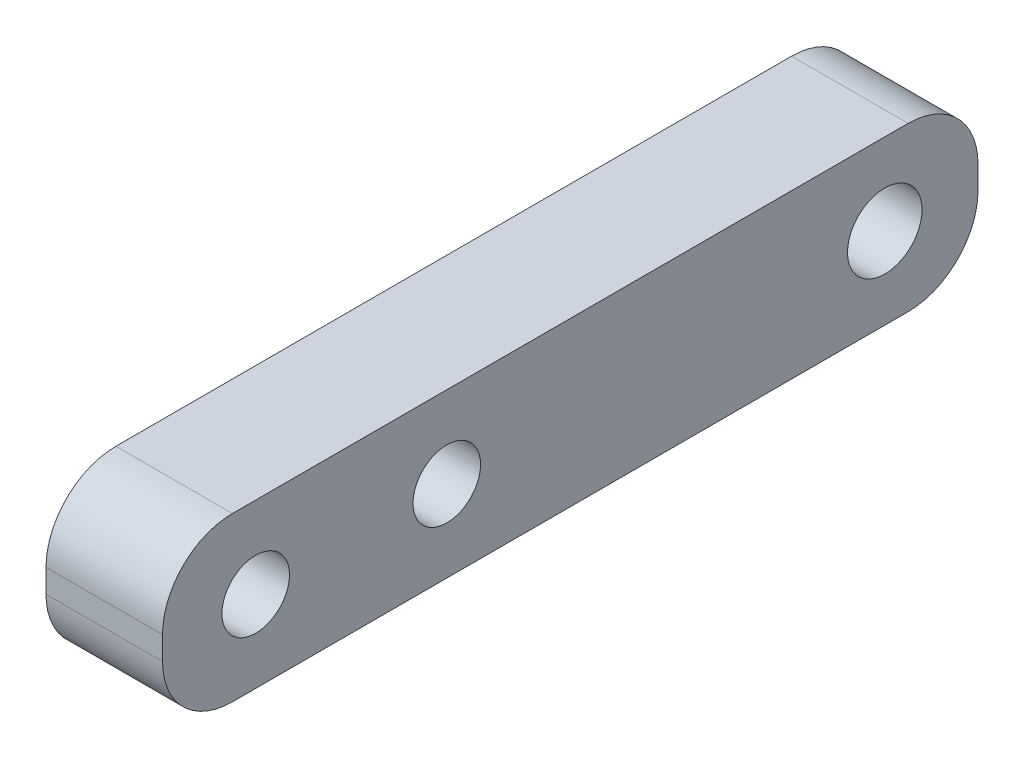
ISO-10303-21;
HEADER;
FILE_DESCRIPTION(('STEP AP214'),'2;1');
FILE_NAME('part.step','',(''),(''),'','','');
FILE_SCHEMA(('AUTOMOTIVE_DESIGN { 1 0 10303 214 1 1 1 1 }'));
ENDSEC;
DATA;
#1=APPLICATION_CONTEXT('core data for automotive mechanical design processes');
#2=APPLICATION_PROTOCOL_DEFINITION('international standard','automotive_design',2000,#1);
#3=PRODUCT_CONTEXT('',#1,'mechanical');
#4=PRODUCT('Part','Part','',(#3));
#5=PRODUCT_RELATED_PRODUCT_CATEGORY('part','',(#4));
#6=PRODUCT_DEFINITION_FORMATION('','',#4);
#7=PRODUCT_DEFINITION_CONTEXT('part definition',#1,'design');
#8=PRODUCT_DEFINITION('design','',#6,#7);
#9=PRODUCT_DEFINITION_SHAPE('','',#8);
#10=(LENGTH_UNIT() NAMED_UNIT(*) SI_UNIT(.MILLI.,.METRE.));
#11=(NAMED_UNIT(*) PLANE_ANGLE_UNIT() SI_UNIT($,.RADIAN.));
#12=(NAMED_UNIT(*) SI_UNIT($,.STERADIAN.) SOLID_ANGLE_UNIT());
#13=UNCERTAINTY_MEASURE_WITH_UNIT(LENGTH_MEASURE(1.E-05),#10,'distance_accuracy_value','');
#14=(GEOMETRIC_REPRESENTATION_CONTEXT(3) GLOBAL_UNCERTAINTY_ASSIGNED_CONTEXT((#13)) GLOBAL_UNIT_ASSIGNED_CONTEXT((#10,
#11,#12)) REPRESENTATION_CONTEXT('',''));
#15=CARTESIAN_POINT('',(0.,0.,0.));
#16=DIRECTION('',(0.,0.,1.));
#17=DIRECTION('',(1.,0.,0.));
#18=AXIS2_PLACEMENT_3D('',#15,#16,#17);
#19=CARTESIAN_POINT('',(5.,0.,0.));
#20=DIRECTION('',(0.,0.,-1.));
#21=DIRECTION('',(0.,1.,0.));
#22=AXIS2_PLACEMENT_3D('',#19,#20,#21);
#23=PLANE('',#22);
#24=DIRECTION('',(0.,-1.,0.));
#25=VECTOR('',#24,1.);
#26=CARTESIAN_POINT('',(5.,0.,0.));
#27=LINE('',#26,#25);
#28=CARTESIAN_POINT('',(5.,-3.,0.));
#29=VERTEX_POINT('',#28);
#30=CARTESIAN_POINT('',(5.,-4.,0.));
#31=VERTEX_POINT('',#30);
#32=EDGE_CURVE('E128',#29,#31,#27,.T.);
#33=ORIENTED_EDGE('',*,*,#32,.F.);
#34=DIRECTION('',(-1.,0.,0.));
#35=VECTOR('',#34,1.);
#36=CARTESIAN_POINT('',(5.,-3.,0.));
#37=LINE('',#36,#35);
#38=CARTESIAN_POINT('',(0.,-3.,0.));
#39=VERTEX_POINT('',#38);
#40=EDGE_CURVE('E11',#29,#39,#37,.T.);
#41=ORIENTED_EDGE('',*,*,#40,.T.);
#42=DIRECTION('',(0.,-1.,0.));
#43=VECTOR('',#42,1.);
#44=CARTESIAN_POINT('',(0.,0.,0.));
#45=LINE('',#44,#43);
#46=CARTESIAN_POINT('',(0.,-4.,0.));
#47=VERTEX_POINT('',#46);
#48=EDGE_CURVE('E130',#39,#47,#45,.T.);
#49=ORIENTED_EDGE('',*,*,#48,.T.);
#50=DIRECTION('',(-1.,0.,0.));
#51=VECTOR('',#50,1.);
#52=CARTESIAN_POINT('',(5.,-4.,0.));
#53=LINE('',#52,#51);
#54=EDGE_CURVE('E41',#47,#31,#53,.F.);
#55=ORIENTED_EDGE('',*,*,#54,.T.);
#56=EDGE_LOOP('',(#33,#41,#49,#55));
#57=FACE_BOUND('',#56,.T.);
#58=ADVANCED_FACE('F33',(#57),#23,.F.);
#59=CARTESIAN_POINT('',(5.,-7.,0.));
#60=DIRECTION('',(0.,1.,0.));
#61=DIRECTION('',(0.,0.,1.));
#62=AXIS2_PLACEMENT_3D('',#59,#60,#61);
#63=PLANE('',#62);
#64=DIRECTION('',(0.,0.,-1.));
#65=VECTOR('',#64,1.);
#66=CARTESIAN_POINT('',(0.,-7.,0.));
#67=LINE('',#66,#65);
#68=CARTESIAN_POINT('',(0.,-7.,-3.));
#69=VERTEX_POINT('',#68);
#70=CARTESIAN_POINT('',(0.,-7.,-32.));
#71=VERTEX_POINT('',#70);
#72=EDGE_CURVE('E126',#69,#71,#67,.T.);
#73=ORIENTED_EDGE('',*,*,#72,.T.);
#74=DIRECTION('',(-1.,0.,0.));
#75=VECTOR('',#74,1.);
#76=CARTESIAN_POINT('',(5.,-7.,-32.));
#77=LINE('',#76,#75);
#78=CARTESIAN_POINT('',(5.,-7.,-32.));
#79=VERTEX_POINT('',#78);
#80=EDGE_CURVE('E105',#71,#79,#77,.F.);
#81=ORIENTED_EDGE('',*,*,#80,.T.);
#82=DIRECTION('',(0.,0.,-1.));
#83=VECTOR('',#82,1.);
#84=CARTESIAN_POINT('',(5.,-7.,0.));
#85=LINE('',#84,#83);
#86=CARTESIAN_POINT('',(5.,-7.,-3.));
#87=VERTEX_POINT('',#86);
#88=EDGE_CURVE('E166',#87,#79,#85,.T.);
#89=ORIENTED_EDGE('',*,*,#88,.F.);
#90=DIRECTION('',(-1.,0.,0.));
#91=VECTOR('',#90,1.);
#92=CARTESIAN_POINT('',(5.,-7.,-3.));
#93=LINE('',#92,#91);
#94=EDGE_CURVE('E110',#87,#69,#93,.T.);
#95=ORIENTED_EDGE('',*,*,#94,.T.);
#96=EDGE_LOOP('',(#73,#81,#89,#95));
#97=FACE_BOUND('',#96,.T.);
#98=ADVANCED_FACE('F170',(#97),#63,.F.);
#99=CARTESIAN_POINT('',(5.,0.,-35.));
#100=DIRECTION('',(0.,0.,1.));
#101=DIRECTION('',(1.,0.,0.));
#102=AXIS2_PLACEMENT_3D('',#99,#100,#101);
#103=PLANE('',#102);
#104=DIRECTION('',(0.,1.,0.));
#105=VECTOR('',#104,1.);
#106=CARTESIAN_POINT('',(5.,0.,-35.));
#107=LINE('',#106,#105);
#108=CARTESIAN_POINT('',(5.,-4.,-35.));
#109=VERTEX_POINT('',#108);
#110=CARTESIAN_POINT('',(5.,-3.,-35.));
#111=VERTEX_POINT('',#110);
#112=EDGE_CURVE('E119',#109,#111,#107,.T.);
#113=ORIENTED_EDGE('',*,*,#112,.F.);
#114=DIRECTION('',(-1.,0.,0.));
#115=VECTOR('',#114,1.);
#116=CARTESIAN_POINT('',(5.,-4.,-35.));
#117=LINE('',#116,#115);
#118=CARTESIAN_POINT('',(0.,-4.,-35.));
#119=VERTEX_POINT('',#118);
#120=EDGE_CURVE('E104',#109,#119,#117,.T.);
#121=ORIENTED_EDGE('',*,*,#120,.T.);
#122=DIRECTION('',(0.,1.,0.));
#123=VECTOR('',#122,1.);
#124=CARTESIAN_POINT('',(0.,0.,-35.));
#125=LINE('',#124,#123);
#126=CARTESIAN_POINT('',(0.,-3.,-35.));
#127=VERTEX_POINT('',#126);
#128=EDGE_CURVE('E117',#119,#127,#125,.T.);
#129=ORIENTED_EDGE('',*,*,#128,.T.);
#130=DIRECTION('',(-1.,0.,0.));
#131=VECTOR('',#130,1.);
#132=CARTESIAN_POINT('',(5.,-3.,-35.));
#133=LINE('',#132,#131);
#134=EDGE_CURVE('E121',#127,#111,#133,.F.);
#135=ORIENTED_EDGE('',*,*,#134,.T.);
#136=EDGE_LOOP('',(#113,#121,#129,#135));
#137=FACE_BOUND('',#136,.T.);
#138=ADVANCED_FACE('F116',(#137),#103,.F.);
#139=CARTESIAN_POINT('',(5.,0.,0.));
#140=DIRECTION('',(0.,-1.,0.));
#141=DIRECTION('',(0.,0.,-1.));
#142=AXIS2_PLACEMENT_3D('',#139,#140,#141);
#143=PLANE('',#142);
#144=DIRECTION('',(0.,0.,1.));
#145=VECTOR('',#144,1.);
#146=CARTESIAN_POINT('',(5.,0.,0.));
#147=LINE('',#146,#145);
#148=CARTESIAN_POINT('',(5.,0.,-32.));
#149=VERTEX_POINT('',#148);
#150=CARTESIAN_POINT('',(5.,0.,-3.));
#151=VERTEX_POINT('',#150);
#152=EDGE_CURVE('E134',#149,#151,#147,.T.);
#153=ORIENTED_EDGE('',*,*,#152,.F.);
#154=DIRECTION('',(-1.,0.,0.));
#155=VECTOR('',#154,1.);
#156=CARTESIAN_POINT('',(5.,0.,-32.));
#157=LINE('',#156,#155);
#158=CARTESIAN_POINT('',(0.,0.,-32.));
#159=VERTEX_POINT('',#158);
#160=EDGE_CURVE('E151',#149,#159,#157,.T.);
#161=ORIENTED_EDGE('',*,*,#160,.T.);
#162=DIRECTION('',(0.,0.,1.));
#163=VECTOR('',#162,1.);
#164=CARTESIAN_POINT('',(0.,0.,0.));
#165=LINE('',#164,#163);
#166=CARTESIAN_POINT('',(0.,0.,-3.));
#167=VERTEX_POINT('',#166);
#168=EDGE_CURVE('E125',#159,#167,#165,.T.);
#169=ORIENTED_EDGE('',*,*,#168,.T.);
#170=DIRECTION('',(-1.,0.,0.));
#171=VECTOR('',#170,1.);
#172=CARTESIAN_POINT('',(5.,0.,-3.));
#173=LINE('',#172,#171);
#174=EDGE_CURVE('E48',#167,#151,#173,.F.);
#175=ORIENTED_EDGE('',*,*,#174,.T.);
#176=EDGE_LOOP('',(#153,#161,#169,#175));
#177=FACE_BOUND('',#176,.T.);
#178=ADVANCED_FACE('F205',(#177),#143,.F.);
#179=CARTESIAN_POINT('',(5.,0.,0.));
#180=DIRECTION('',(1.,0.,0.));
#181=DIRECTION('',(0.,0.,-1.));
#182=AXIS2_PLACEMENT_3D('',#179,#180,#181);
#183=PLANE('',#182);
#184=CARTESIAN_POINT('',(5.,-3.5,-12.2));
#185=DIRECTION('',(1.,0.,0.));
#186=DIRECTION('',(0.,0.,-1.));
#187=AXIS2_PLACEMENT_3D('',#184,#185,#186);
#188=CIRCLE('',#187,1.45);
#189=CARTESIAN_POINT('',(5.,-3.5,-13.65));
#190=VERTEX_POINT('',#189);
#191=EDGE_CURVE('E188',#190,#190,#188,.T.);
#192=ORIENTED_EDGE('',*,*,#191,.F.);
#193=EDGE_LOOP('',(#192));
#194=FACE_BOUND('',#193,.T.);
#195=CARTESIAN_POINT('',(5.,-3.5,-31.));
#196=DIRECTION('',(1.,0.,0.));
#197=DIRECTION('',(0.,0.,-1.));
#198=AXIS2_PLACEMENT_3D('',#195,#196,#197);
#199=CIRCLE('',#198,1.6);
#200=CARTESIAN_POINT('',(5.,-3.5,-32.6));
#201=VERTEX_POINT('',#200);
#202=EDGE_CURVE('E182',#201,#201,#199,.T.);
#203=ORIENTED_EDGE('',*,*,#202,.F.);
#204=EDGE_LOOP('',(#203));
#205=FACE_BOUND('',#204,.T.);
#206=CARTESIAN_POINT('',(5.,-3.5,-4.));
#207=DIRECTION('',(1.,0.,0.));
#208=DIRECTION('',(0.,0.,-1.));
#209=AXIS2_PLACEMENT_3D('',#206,#207,#208);
#210=CIRCLE('',#209,1.45);
#211=CARTESIAN_POINT('',(5.,-3.5,-5.45));
#212=VERTEX_POINT('',#211);
#213=EDGE_CURVE('E173',#212,#212,#210,.T.);
#214=ORIENTED_EDGE('',*,*,#213,.F.);
#215=EDGE_LOOP('',(#214));
#216=FACE_BOUND('',#215,.T.);
#217=ORIENTED_EDGE('',*,*,#88,.T.);
#218=CARTESIAN_POINT('',(5.,-4.,-32.));
#219=DIRECTION('',(1.,0.,0.));
#220=DIRECTION('',(0.,0.,-1.));
#221=AXIS2_PLACEMENT_3D('',#218,#219,#220);
#222=CIRCLE('',#221,3.);
#223=EDGE_CURVE('E148',#79,#109,#222,.T.);
#224=ORIENTED_EDGE('',*,*,#223,.T.);
#225=ORIENTED_EDGE('',*,*,#112,.T.);
#226=CARTESIAN_POINT('',(5.,-3.,-32.));
#227=DIRECTION('',(1.,0.,0.));
#228=DIRECTION('',(0.,0.,-1.));
#229=AXIS2_PLACEMENT_3D('',#226,#227,#228);
#230=CIRCLE('',#229,3.);
#231=EDGE_CURVE('E55',#111,#149,#230,.T.);
#232=ORIENTED_EDGE('',*,*,#231,.T.);
#233=ORIENTED_EDGE('',*,*,#152,.T.);
#234=CARTESIAN_POINT('',(5.,-3.,-3.));
#235=DIRECTION('',(1.,0.,0.));
#236=DIRECTION('',(0.,0.,-1.));
#237=AXIS2_PLACEMENT_3D('',#234,#235,#236);
#238=CIRCLE('',#237,3.);
#239=EDGE_CURVE('E145',#151,#29,#238,.T.);
#240=ORIENTED_EDGE('',*,*,#239,.T.);
#241=ORIENTED_EDGE('',*,*,#32,.T.);
#242=CARTESIAN_POINT('',(5.,-4.,-3.));
#243=DIRECTION('',(1.,0.,0.));
#244=DIRECTION('',(0.,0.,-1.));
#245=AXIS2_PLACEMENT_3D('',#242,#243,#244);
#246=CIRCLE('',#245,3.);
#247=EDGE_CURVE('E143',#31,#87,#246,.T.);
#248=ORIENTED_EDGE('',*,*,#247,.T.);
#249=EDGE_LOOP('',(#217,#224,#225,#232,#233,#240,#241,#248));
#250=FACE_BOUND('',#249,.T.);
#251=ADVANCED_FACE('F163',(#194,#205,#216,#250),#183,.T.);
#252=CARTESIAN_POINT('',(0.,0.,0.));
#253=DIRECTION('',(1.,0.,0.));
#254=DIRECTION('',(0.,0.,-1.));
#255=AXIS2_PLACEMENT_3D('',#252,#253,#254);
#256=PLANE('',#255);
#257=CARTESIAN_POINT('',(0.,-3.5,-12.2));
#258=DIRECTION('',(1.,0.,0.));
#259=DIRECTION('',(0.,0.,-1.));
#260=AXIS2_PLACEMENT_3D('',#257,#258,#259);
#261=CIRCLE('',#260,1.45);
#262=CARTESIAN_POINT('',(0.,-3.5,-13.65));
#263=VERTEX_POINT('',#262);
#264=EDGE_CURVE('E180',#263,#263,#261,.T.);
#265=ORIENTED_EDGE('',*,*,#264,.T.);
#266=EDGE_LOOP('',(#265));
#267=FACE_BOUND('',#266,.T.);
#268=CARTESIAN_POINT('',(0.,-3.5,-31.));
#269=DIRECTION('',(1.,0.,0.));
#270=DIRECTION('',(0.,0.,-1.));
#271=AXIS2_PLACEMENT_3D('',#268,#269,#270);
#272=CIRCLE('',#271,1.6);
#273=CARTESIAN_POINT('',(0.,-3.5,-32.6));
#274=VERTEX_POINT('',#273);
#275=EDGE_CURVE('E185',#274,#274,#272,.T.);
#276=ORIENTED_EDGE('',*,*,#275,.T.);
#277=EDGE_LOOP('',(#276));
#278=FACE_BOUND('',#277,.T.);
#279=CARTESIAN_POINT('',(0.,-3.5,-4.));
#280=DIRECTION('',(1.,0.,0.));
#281=DIRECTION('',(0.,0.,-1.));
#282=AXIS2_PLACEMENT_3D('',#279,#280,#281);
#283=CIRCLE('',#282,1.45);
#284=CARTESIAN_POINT('',(0.,-3.5,-5.45));
#285=VERTEX_POINT('',#284);
#286=EDGE_CURVE('E171',#285,#285,#283,.T.);
#287=ORIENTED_EDGE('',*,*,#286,.T.);
#288=EDGE_LOOP('',(#287));
#289=FACE_BOUND('',#288,.T.);
#290=ORIENTED_EDGE('',*,*,#128,.F.);
#291=CARTESIAN_POINT('',(0.,-4.,-32.));
#292=DIRECTION('',(1.,0.,0.));
#293=DIRECTION('',(0.,0.,-1.));
#294=AXIS2_PLACEMENT_3D('',#291,#292,#293);
#295=CIRCLE('',#294,3.);
#296=EDGE_CURVE('E100',#119,#71,#295,.F.);
#297=ORIENTED_EDGE('',*,*,#296,.T.);
#298=ORIENTED_EDGE('',*,*,#72,.F.);
#299=CARTESIAN_POINT('',(0.,-4.,-3.));
#300=DIRECTION('',(1.,0.,0.));
#301=DIRECTION('',(0.,0.,-1.));
#302=AXIS2_PLACEMENT_3D('',#299,#300,#301);
#303=CIRCLE('',#302,3.);
#304=EDGE_CURVE('E120',#69,#47,#303,.F.);
#305=ORIENTED_EDGE('',*,*,#304,.T.);
#306=ORIENTED_EDGE('',*,*,#48,.F.);
#307=CARTESIAN_POINT('',(0.,-3.,-3.));
#308=DIRECTION('',(1.,0.,0.));
#309=DIRECTION('',(0.,0.,-1.));
#310=AXIS2_PLACEMENT_3D('',#307,#308,#309);
#311=CIRCLE('',#310,3.);
#312=EDGE_CURVE('E137',#39,#167,#311,.F.);
#313=ORIENTED_EDGE('',*,*,#312,.T.);
#314=ORIENTED_EDGE('',*,*,#168,.F.);
#315=CARTESIAN_POINT('',(0.,-3.,-32.));
#316=DIRECTION('',(1.,0.,0.));
#317=DIRECTION('',(0.,0.,-1.));
#318=AXIS2_PLACEMENT_3D('',#315,#316,#317);
#319=CIRCLE('',#318,3.);
#320=EDGE_CURVE('E111',#159,#127,#319,.F.);
#321=ORIENTED_EDGE('',*,*,#320,.T.);
#322=EDGE_LOOP('',(#290,#297,#298,#305,#306,#313,#314,#321));
#323=FACE_BOUND('',#322,.T.);
#324=ADVANCED_FACE('F123',(#267,#278,#289,#323),#256,.F.);
#325=CARTESIAN_POINT('',(0.,-3.5,-4.));
#326=DIRECTION('',(1.,0.,0.));
#327=DIRECTION('',(0.,0.,-1.));
#328=AXIS2_PLACEMENT_3D('',#325,#326,#327);
#329=CYLINDRICAL_SURFACE('',#328,1.45);
#330=ORIENTED_EDGE('',*,*,#286,.F.);
#331=EDGE_LOOP('',(#330));
#332=FACE_BOUND('',#331,.T.);
#333=ORIENTED_EDGE('',*,*,#213,.T.);
#334=EDGE_LOOP('',(#333));
#335=FACE_BOUND('',#334,.T.);
#336=ADVANCED_FACE('F211',(#332,#335),#329,.F.);
#337=CARTESIAN_POINT('',(0.,-3.5,-31.));
#338=DIRECTION('',(1.,0.,0.));
#339=DIRECTION('',(0.,0.,-1.));
#340=AXIS2_PLACEMENT_3D('',#337,#338,#339);
#341=CYLINDRICAL_SURFACE('',#340,1.6);
#342=ORIENTED_EDGE('',*,*,#275,.F.);
#343=EDGE_LOOP('',(#342));
#344=FACE_BOUND('',#343,.T.);
#345=ORIENTED_EDGE('',*,*,#202,.T.);
#346=EDGE_LOOP('',(#345));
#347=FACE_BOUND('',#346,.T.);
#348=ADVANCED_FACE('F199',(#344,#347),#341,.F.);
#349=CARTESIAN_POINT('',(0.,-3.5,-12.2));
#350=DIRECTION('',(1.,0.,0.));
#351=DIRECTION('',(0.,0.,-1.));
#352=AXIS2_PLACEMENT_3D('',#349,#350,#351);
#353=CYLINDRICAL_SURFACE('',#352,1.45);
#354=ORIENTED_EDGE('',*,*,#264,.F.);
#355=EDGE_LOOP('',(#354));
#356=FACE_BOUND('',#355,.T.);
#357=ORIENTED_EDGE('',*,*,#191,.T.);
#358=EDGE_LOOP('',(#357));
#359=FACE_BOUND('',#358,.T.);
#360=ADVANCED_FACE('F196',(#356,#359),#353,.F.);
#361=CARTESIAN_POINT('',(5.,-4.,-32.));
#362=DIRECTION('',(-1.,0.,0.));
#363=DIRECTION('',(0.,0.,1.));
#364=AXIS2_PLACEMENT_3D('',#361,#362,#363);
#365=CYLINDRICAL_SURFACE('',#364,3.);
#366=ORIENTED_EDGE('',*,*,#223,.F.);
#367=ORIENTED_EDGE('',*,*,#80,.F.);
#368=ORIENTED_EDGE('',*,*,#296,.F.);
#369=ORIENTED_EDGE('',*,*,#120,.F.);
#370=EDGE_LOOP('',(#366,#367,#368,#369));
#371=FACE_BOUND('',#370,.T.);
#372=ADVANCED_FACE('F103',(#371),#365,.T.);
#373=CARTESIAN_POINT('',(5.,-3.,-32.));
#374=DIRECTION('',(-1.,0.,0.));
#375=DIRECTION('',(0.,0.,1.));
#376=AXIS2_PLACEMENT_3D('',#373,#374,#375);
#377=CYLINDRICAL_SURFACE('',#376,3.);
#378=ORIENTED_EDGE('',*,*,#231,.F.);
#379=ORIENTED_EDGE('',*,*,#134,.F.);
#380=ORIENTED_EDGE('',*,*,#320,.F.);
#381=ORIENTED_EDGE('',*,*,#160,.F.);
#382=EDGE_LOOP('',(#378,#379,#380,#381));
#383=FACE_BOUND('',#382,.T.);
#384=ADVANCED_FACE('F233',(#383),#377,.T.);
#385=CARTESIAN_POINT('',(5.,-3.,-3.));
#386=DIRECTION('',(-1.,0.,0.));
#387=DIRECTION('',(0.,0.,1.));
#388=AXIS2_PLACEMENT_3D('',#385,#386,#387);
#389=CYLINDRICAL_SURFACE('',#388,3.);
#390=ORIENTED_EDGE('',*,*,#239,.F.);
#391=ORIENTED_EDGE('',*,*,#174,.F.);
#392=ORIENTED_EDGE('',*,*,#312,.F.);
#393=ORIENTED_EDGE('',*,*,#40,.F.);
#394=EDGE_LOOP('',(#390,#391,#392,#393));
#395=FACE_BOUND('',#394,.T.);
#396=ADVANCED_FACE('F235',(#395),#389,.T.);
#397=CARTESIAN_POINT('',(5.,-4.,-3.));
#398=DIRECTION('',(-1.,0.,0.));
#399=DIRECTION('',(0.,0.,1.));
#400=AXIS2_PLACEMENT_3D('',#397,#398,#399);
#401=CYLINDRICAL_SURFACE('',#400,3.);
#402=ORIENTED_EDGE('',*,*,#247,.F.);
#403=ORIENTED_EDGE('',*,*,#54,.F.);
#404=ORIENTED_EDGE('',*,*,#304,.F.);
#405=ORIENTED_EDGE('',*,*,#94,.F.);
#406=EDGE_LOOP('',(#402,#403,#404,#405));
#407=FACE_BOUND('',#406,.T.);
#408=ADVANCED_FACE('F35',(#407),#401,.T.);
#409=CLOSED_SHELL('',(#58,#98,#138,#178,#251,#324,#336,#348,#360,#372,#384,#396,#408));
#410=MANIFOLD_SOLID_BREP('B2',#409);
#411=ADVANCED_BREP_SHAPE_REPRESENTATION('',(#18,#410),#14);
#412=SHAPE_DEFINITION_REPRESENTATION(#9,#411);
ENDSEC;
END-ISO-10303-21;
